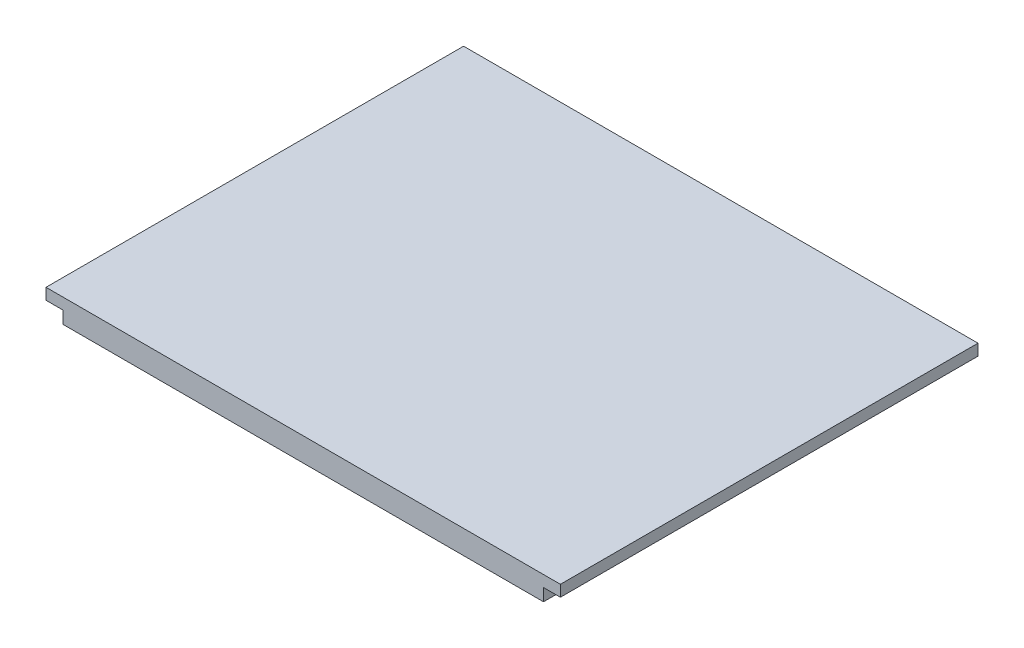
ISO-10303-21;
HEADER;
FILE_DESCRIPTION(('STEP AP214'),'2;1');
FILE_NAME('part.step','',(''),(''),'','','');
FILE_SCHEMA(('AUTOMOTIVE_DESIGN { 1 0 10303 214 1 1 1 1 }'));
ENDSEC;
DATA;
#1=APPLICATION_CONTEXT('core data for automotive mechanical design processes');
#2=APPLICATION_PROTOCOL_DEFINITION('international standard','automotive_design',2000,#1);
#3=PRODUCT_CONTEXT('',#1,'mechanical');
#4=PRODUCT('Part','Part','',(#3));
#5=PRODUCT_RELATED_PRODUCT_CATEGORY('part','',(#4));
#6=PRODUCT_DEFINITION_FORMATION('','',#4);
#7=PRODUCT_DEFINITION_CONTEXT('part definition',#1,'design');
#8=PRODUCT_DEFINITION('design','',#6,#7);
#9=PRODUCT_DEFINITION_SHAPE('','',#8);
#10=(LENGTH_UNIT() NAMED_UNIT(*) SI_UNIT(.MILLI.,.METRE.));
#11=(NAMED_UNIT(*) PLANE_ANGLE_UNIT() SI_UNIT($,.RADIAN.));
#12=(NAMED_UNIT(*) SI_UNIT($,.STERADIAN.) SOLID_ANGLE_UNIT());
#13=UNCERTAINTY_MEASURE_WITH_UNIT(LENGTH_MEASURE(1.E-05),#10,'distance_accuracy_value','');
#14=(GEOMETRIC_REPRESENTATION_CONTEXT(3) GLOBAL_UNCERTAINTY_ASSIGNED_CONTEXT((#13)) GLOBAL_UNIT_ASSIGNED_CONTEXT((#10,
#11,#12)) REPRESENTATION_CONTEXT('',''));
#15=CARTESIAN_POINT('',(0.,0.,0.));
#16=DIRECTION('',(0.,0.,1.));
#17=DIRECTION('',(1.,0.,0.));
#18=AXIS2_PLACEMENT_3D('',#15,#16,#17);
#19=CARTESIAN_POINT('',(-42.7,0.,74.2));
#20=DIRECTION('',(1.,0.,0.));
#21=DIRECTION('',(0.,0.,-1.));
#22=AXIS2_PLACEMENT_3D('',#19,#20,#21);
#23=PLANE('',#22);
#24=DIRECTION('',(0.,-1.,0.));
#25=VECTOR('',#24,1.);
#26=CARTESIAN_POINT('',(-42.7,0.,0.));
#27=LINE('',#26,#25);
#28=CARTESIAN_POINT('',(-42.7,2.19999999999999,0.));
#29=VERTEX_POINT('',#28);
#30=CARTESIAN_POINT('',(-42.7,0.,0.));
#31=VERTEX_POINT('',#30);
#32=EDGE_CURVE('E137',#29,#31,#27,.T.);
#33=ORIENTED_EDGE('',*,*,#32,.T.);
#34=DIRECTION('',(0.,0.,-1.));
#35=VECTOR('',#34,1.);
#36=CARTESIAN_POINT('',(-42.7,0.,74.2));
#37=LINE('',#36,#35);
#38=CARTESIAN_POINT('',(-42.7,0.,74.2));
#39=VERTEX_POINT('',#38);
#40=EDGE_CURVE('E11',#39,#31,#37,.T.);
#41=ORIENTED_EDGE('',*,*,#40,.F.);
#42=DIRECTION('',(0.,-1.,0.));
#43=VECTOR('',#42,1.);
#44=CARTESIAN_POINT('',(-42.7,0.,74.2));
#45=LINE('',#44,#43);
#46=CARTESIAN_POINT('',(-42.7,2.19999999999999,74.2));
#47=VERTEX_POINT('',#46);
#48=EDGE_CURVE('E154',#47,#39,#45,.T.);
#49=ORIENTED_EDGE('',*,*,#48,.F.);
#50=DIRECTION('',(0.,0.,-1.));
#51=VECTOR('',#50,1.);
#52=CARTESIAN_POINT('',(-42.7,2.19999999999999,74.2));
#53=LINE('',#52,#51);
#54=EDGE_CURVE('E133',#47,#29,#53,.T.);
#55=ORIENTED_EDGE('',*,*,#54,.T.);
#56=EDGE_LOOP('',(#33,#41,#49,#55));
#57=FACE_BOUND('',#56,.T.);
#58=ADVANCED_FACE('F39',(#57),#23,.F.);
#59=CARTESIAN_POINT('',(42.7,0.,74.2));
#60=DIRECTION('',(0.,1.,0.));
#61=DIRECTION('',(0.,0.,1.));
#62=AXIS2_PLACEMENT_3D('',#59,#60,#61);
#63=PLANE('',#62);
#64=DIRECTION('',(1.,0.,0.));
#65=VECTOR('',#64,1.);
#66=CARTESIAN_POINT('',(42.7,0.,0.));
#67=LINE('',#66,#65);
#68=CARTESIAN_POINT('',(42.7,0.,0.));
#69=VERTEX_POINT('',#68);
#70=EDGE_CURVE('E140',#31,#69,#67,.T.);
#71=ORIENTED_EDGE('',*,*,#70,.T.);
#72=DIRECTION('',(0.,0.,-1.));
#73=VECTOR('',#72,1.);
#74=CARTESIAN_POINT('',(42.7,0.,74.2));
#75=LINE('',#74,#73);
#76=CARTESIAN_POINT('',(42.7,0.,74.2));
#77=VERTEX_POINT('',#76);
#78=EDGE_CURVE('E47',#77,#69,#75,.T.);
#79=ORIENTED_EDGE('',*,*,#78,.F.);
#80=DIRECTION('',(1.,0.,0.));
#81=VECTOR('',#80,1.);
#82=CARTESIAN_POINT('',(42.7,0.,74.2));
#83=LINE('',#82,#81);
#84=EDGE_CURVE('E99',#39,#77,#83,.T.);
#85=ORIENTED_EDGE('',*,*,#84,.F.);
#86=ORIENTED_EDGE('',*,*,#40,.T.);
#87=EDGE_LOOP('',(#71,#79,#85,#86));
#88=FACE_BOUND('',#87,.T.);
#89=ADVANCED_FACE('F193',(#88),#63,.F.);
#90=CARTESIAN_POINT('',(42.7,2.19999999999999,74.2));
#91=DIRECTION('',(-1.,0.,0.));
#92=DIRECTION('',(0.,0.,1.));
#93=AXIS2_PLACEMENT_3D('',#90,#91,#92);
#94=PLANE('',#93);
#95=DIRECTION('',(0.,1.,0.));
#96=VECTOR('',#95,1.);
#97=CARTESIAN_POINT('',(42.7,2.19999999999999,0.));
#98=LINE('',#97,#96);
#99=CARTESIAN_POINT('',(42.7,2.19999999999999,0.));
#100=VERTEX_POINT('',#99);
#101=EDGE_CURVE('E143',#69,#100,#98,.T.);
#102=ORIENTED_EDGE('',*,*,#101,.T.);
#103=DIRECTION('',(0.,0.,-1.));
#104=VECTOR('',#103,1.);
#105=CARTESIAN_POINT('',(42.7,2.19999999999999,74.2));
#106=LINE('',#105,#104);
#107=CARTESIAN_POINT('',(42.7,2.19999999999999,74.2));
#108=VERTEX_POINT('',#107);
#109=EDGE_CURVE('E163',#108,#100,#106,.T.);
#110=ORIENTED_EDGE('',*,*,#109,.F.);
#111=DIRECTION('',(0.,1.,0.));
#112=VECTOR('',#111,1.);
#113=CARTESIAN_POINT('',(42.7,2.19999999999999,74.2));
#114=LINE('',#113,#112);
#115=EDGE_CURVE('E173',#77,#108,#114,.T.);
#116=ORIENTED_EDGE('',*,*,#115,.F.);
#117=ORIENTED_EDGE('',*,*,#78,.T.);
#118=EDGE_LOOP('',(#102,#110,#116,#117));
#119=FACE_BOUND('',#118,.T.);
#120=ADVANCED_FACE('F171',(#119),#94,.F.);
#121=CARTESIAN_POINT('',(45.7,2.19999999999999,74.2));
#122=DIRECTION('',(0.,1.,0.));
#123=DIRECTION('',(-1.,0.,0.));
#124=AXIS2_PLACEMENT_3D('',#121,#122,#123);
#125=PLANE('',#124);
#126=DIRECTION('',(1.,0.,0.));
#127=VECTOR('',#126,1.);
#128=CARTESIAN_POINT('',(45.7,2.19999999999999,0.));
#129=LINE('',#128,#127);
#130=CARTESIAN_POINT('',(45.7,2.19999999999999,0.));
#131=VERTEX_POINT('',#130);
#132=EDGE_CURVE('E145',#100,#131,#129,.T.);
#133=ORIENTED_EDGE('',*,*,#132,.T.);
#134=DIRECTION('',(0.,0.,-1.));
#135=VECTOR('',#134,1.);
#136=CARTESIAN_POINT('',(45.7,2.19999999999999,74.2));
#137=LINE('',#136,#135);
#138=CARTESIAN_POINT('',(45.7,2.19999999999999,74.2));
#139=VERTEX_POINT('',#138);
#140=EDGE_CURVE('E159',#139,#131,#137,.T.);
#141=ORIENTED_EDGE('',*,*,#140,.F.);
#142=DIRECTION('',(1.,0.,0.));
#143=VECTOR('',#142,1.);
#144=CARTESIAN_POINT('',(45.7,2.19999999999999,74.2));
#145=LINE('',#144,#143);
#146=EDGE_CURVE('E185',#108,#139,#145,.T.);
#147=ORIENTED_EDGE('',*,*,#146,.F.);
#148=ORIENTED_EDGE('',*,*,#109,.T.);
#149=EDGE_LOOP('',(#133,#141,#147,#148));
#150=FACE_BOUND('',#149,.T.);
#151=ADVANCED_FACE('F181',(#150),#125,.F.);
#152=CARTESIAN_POINT('',(45.7,4.19999999999999,74.2));
#153=DIRECTION('',(-1.,0.,0.));
#154=DIRECTION('',(0.,0.,1.));
#155=AXIS2_PLACEMENT_3D('',#152,#153,#154);
#156=PLANE('',#155);
#157=DIRECTION('',(0.,1.,0.));
#158=VECTOR('',#157,1.);
#159=CARTESIAN_POINT('',(45.7,4.19999999999999,0.));
#160=LINE('',#159,#158);
#161=CARTESIAN_POINT('',(45.7,4.19999999999999,0.));
#162=VERTEX_POINT('',#161);
#163=EDGE_CURVE('E147',#131,#162,#160,.T.);
#164=ORIENTED_EDGE('',*,*,#163,.T.);
#165=DIRECTION('',(0.,0.,-1.));
#166=VECTOR('',#165,1.);
#167=CARTESIAN_POINT('',(45.7,4.19999999999999,74.2));
#168=LINE('',#167,#166);
#169=CARTESIAN_POINT('',(45.7,4.19999999999999,74.2));
#170=VERTEX_POINT('',#169);
#171=EDGE_CURVE('E128',#170,#162,#168,.T.);
#172=ORIENTED_EDGE('',*,*,#171,.F.);
#173=DIRECTION('',(0.,1.,0.));
#174=VECTOR('',#173,1.);
#175=CARTESIAN_POINT('',(45.7,4.19999999999999,74.2));
#176=LINE('',#175,#174);
#177=EDGE_CURVE('E118',#139,#170,#176,.T.);
#178=ORIENTED_EDGE('',*,*,#177,.F.);
#179=ORIENTED_EDGE('',*,*,#140,.T.);
#180=EDGE_LOOP('',(#164,#172,#178,#179));
#181=FACE_BOUND('',#180,.T.);
#182=ADVANCED_FACE('F184',(#181),#156,.F.);
#183=CARTESIAN_POINT('',(-45.7,4.19999999999999,74.2));
#184=DIRECTION('',(0.,-1.,0.));
#185=DIRECTION('',(0.,0.,-1.));
#186=AXIS2_PLACEMENT_3D('',#183,#184,#185);
#187=PLANE('',#186);
#188=DIRECTION('',(-1.,0.,0.));
#189=VECTOR('',#188,1.);
#190=CARTESIAN_POINT('',(-45.7,4.19999999999999,0.));
#191=LINE('',#190,#189);
#192=CARTESIAN_POINT('',(-45.7,4.19999999999999,0.));
#193=VERTEX_POINT('',#192);
#194=EDGE_CURVE('E126',#162,#193,#191,.T.);
#195=ORIENTED_EDGE('',*,*,#194,.T.);
#196=DIRECTION('',(0.,0.,-1.));
#197=VECTOR('',#196,1.);
#198=CARTESIAN_POINT('',(-45.7,4.19999999999999,74.2));
#199=LINE('',#198,#197);
#200=CARTESIAN_POINT('',(-45.7,4.19999999999999,74.2));
#201=VERTEX_POINT('',#200);
#202=EDGE_CURVE('E123',#201,#193,#199,.T.);
#203=ORIENTED_EDGE('',*,*,#202,.F.);
#204=DIRECTION('',(-1.,0.,0.));
#205=VECTOR('',#204,1.);
#206=CARTESIAN_POINT('',(-45.7,4.19999999999999,74.2));
#207=LINE('',#206,#205);
#208=EDGE_CURVE('E112',#170,#201,#207,.T.);
#209=ORIENTED_EDGE('',*,*,#208,.F.);
#210=ORIENTED_EDGE('',*,*,#171,.T.);
#211=EDGE_LOOP('',(#195,#203,#209,#210));
#212=FACE_BOUND('',#211,.T.);
#213=ADVANCED_FACE('F124',(#212),#187,.F.);
#214=CARTESIAN_POINT('',(-45.7,2.19999999999999,74.2));
#215=DIRECTION('',(1.,0.,0.));
#216=DIRECTION('',(0.,0.,-1.));
#217=AXIS2_PLACEMENT_3D('',#214,#215,#216);
#218=PLANE('',#217);
#219=DIRECTION('',(0.,-1.,0.));
#220=VECTOR('',#219,1.);
#221=CARTESIAN_POINT('',(-45.7,2.19999999999999,0.));
#222=LINE('',#221,#220);
#223=CARTESIAN_POINT('',(-45.7,2.19999999999999,0.));
#224=VERTEX_POINT('',#223);
#225=EDGE_CURVE('E85',#193,#224,#222,.T.);
#226=ORIENTED_EDGE('',*,*,#225,.T.);
#227=DIRECTION('',(0.,0.,-1.));
#228=VECTOR('',#227,1.);
#229=CARTESIAN_POINT('',(-45.7,2.19999999999999,74.2));
#230=LINE('',#229,#228);
#231=CARTESIAN_POINT('',(-45.7,2.19999999999999,74.2));
#232=VERTEX_POINT('',#231);
#233=EDGE_CURVE('E129',#232,#224,#230,.T.);
#234=ORIENTED_EDGE('',*,*,#233,.F.);
#235=DIRECTION('',(0.,-1.,0.));
#236=VECTOR('',#235,1.);
#237=CARTESIAN_POINT('',(-45.7,2.19999999999999,74.2));
#238=LINE('',#237,#236);
#239=EDGE_CURVE('E116',#201,#232,#238,.T.);
#240=ORIENTED_EDGE('',*,*,#239,.F.);
#241=ORIENTED_EDGE('',*,*,#202,.T.);
#242=EDGE_LOOP('',(#226,#234,#240,#241));
#243=FACE_BOUND('',#242,.T.);
#244=ADVANCED_FACE('F131',(#243),#218,.F.);
#245=CARTESIAN_POINT('',(-42.7,2.19999999999999,74.2));
#246=DIRECTION('',(0.,1.,0.));
#247=DIRECTION('',(-1.,0.,0.));
#248=AXIS2_PLACEMENT_3D('',#245,#246,#247);
#249=PLANE('',#248);
#250=DIRECTION('',(1.,0.,0.));
#251=VECTOR('',#250,1.);
#252=CARTESIAN_POINT('',(-42.7,2.19999999999999,0.));
#253=LINE('',#252,#251);
#254=EDGE_CURVE('E91',#224,#29,#253,.T.);
#255=ORIENTED_EDGE('',*,*,#254,.T.);
#256=ORIENTED_EDGE('',*,*,#54,.F.);
#257=DIRECTION('',(1.,0.,0.));
#258=VECTOR('',#257,1.);
#259=CARTESIAN_POINT('',(-42.7,2.19999999999999,74.2));
#260=LINE('',#259,#258);
#261=EDGE_CURVE('E55',#232,#47,#260,.T.);
#262=ORIENTED_EDGE('',*,*,#261,.F.);
#263=ORIENTED_EDGE('',*,*,#233,.T.);
#264=EDGE_LOOP('',(#255,#256,#262,#263));
#265=FACE_BOUND('',#264,.T.);
#266=ADVANCED_FACE('F209',(#265),#249,.F.);
#267=CARTESIAN_POINT('',(0.,0.,74.2));
#268=DIRECTION('',(0.,0.,1.));
#269=DIRECTION('',(1.,0.,0.));
#270=AXIS2_PLACEMENT_3D('',#267,#268,#269);
#271=PLANE('',#270);
#272=ORIENTED_EDGE('',*,*,#48,.T.);
#273=ORIENTED_EDGE('',*,*,#84,.T.);
#274=ORIENTED_EDGE('',*,*,#115,.T.);
#275=ORIENTED_EDGE('',*,*,#146,.T.);
#276=ORIENTED_EDGE('',*,*,#177,.T.);
#277=ORIENTED_EDGE('',*,*,#208,.T.);
#278=ORIENTED_EDGE('',*,*,#239,.T.);
#279=ORIENTED_EDGE('',*,*,#261,.T.);
#280=EDGE_LOOP('',(#272,#273,#274,#275,#276,#277,#278,#279));
#281=FACE_BOUND('',#280,.T.);
#282=ADVANCED_FACE('F114',(#281),#271,.T.);
#283=CARTESIAN_POINT('',(0.,0.,0.));
#284=DIRECTION('',(0.,0.,1.));
#285=DIRECTION('',(1.,0.,0.));
#286=AXIS2_PLACEMENT_3D('',#283,#284,#285);
#287=PLANE('',#286);
#288=ORIENTED_EDGE('',*,*,#32,.F.);
#289=ORIENTED_EDGE('',*,*,#254,.F.);
#290=ORIENTED_EDGE('',*,*,#225,.F.);
#291=ORIENTED_EDGE('',*,*,#194,.F.);
#292=ORIENTED_EDGE('',*,*,#163,.F.);
#293=ORIENTED_EDGE('',*,*,#132,.F.);
#294=ORIENTED_EDGE('',*,*,#101,.F.);
#295=ORIENTED_EDGE('',*,*,#70,.F.);
#296=EDGE_LOOP('',(#288,#289,#290,#291,#292,#293,#294,#295));
#297=FACE_BOUND('',#296,.T.);
#298=ADVANCED_FACE('F177',(#297),#287,.F.);
#299=CLOSED_SHELL('',(#58,#89,#120,#151,#182,#213,#244,#266,#282,#298));
#300=MANIFOLD_SOLID_BREP('B2',#299);
#301=ADVANCED_BREP_SHAPE_REPRESENTATION('',(#18,#300),#14);
#302=SHAPE_DEFINITION_REPRESENTATION(#9,#301);
ENDSEC;
END-ISO-10303-21;
